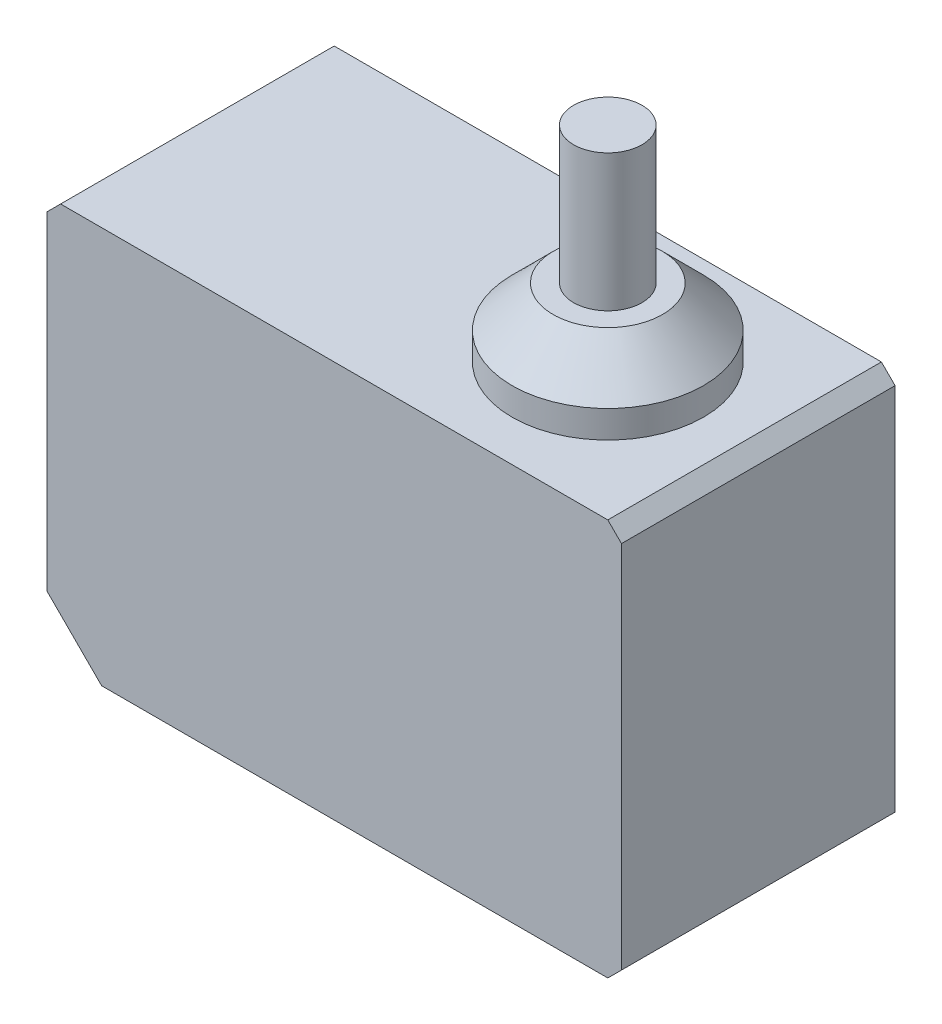
ISO-10303-21;
HEADER;
FILE_DESCRIPTION(('STEP AP214'),'2;1');
FILE_NAME('part.step','',(''),(''),'','','');
FILE_SCHEMA(('AUTOMOTIVE_DESIGN { 1 0 10303 214 1 1 1 1 }'));
ENDSEC;
DATA;
#1=APPLICATION_CONTEXT('core data for automotive mechanical design processes');
#2=APPLICATION_PROTOCOL_DEFINITION('international standard','automotive_design',2000,#1);
#3=PRODUCT_CONTEXT('',#1,'mechanical');
#4=PRODUCT('Part','Part','',(#3));
#5=PRODUCT_RELATED_PRODUCT_CATEGORY('part','',(#4));
#6=PRODUCT_DEFINITION_FORMATION('','',#4);
#7=PRODUCT_DEFINITION_CONTEXT('part definition',#1,'design');
#8=PRODUCT_DEFINITION('design','',#6,#7);
#9=PRODUCT_DEFINITION_SHAPE('','',#8);
#10=(LENGTH_UNIT() NAMED_UNIT(*) SI_UNIT(.MILLI.,.METRE.));
#11=(NAMED_UNIT(*) PLANE_ANGLE_UNIT() SI_UNIT($,.RADIAN.));
#12=(NAMED_UNIT(*) SI_UNIT($,.STERADIAN.) SOLID_ANGLE_UNIT());
#13=UNCERTAINTY_MEASURE_WITH_UNIT(LENGTH_MEASURE(1.E-05),#10,'distance_accuracy_value','');
#14=(GEOMETRIC_REPRESENTATION_CONTEXT(3) GLOBAL_UNCERTAINTY_ASSIGNED_CONTEXT((#13)) GLOBAL_UNIT_ASSIGNED_CONTEXT((#10,
#11,#12)) REPRESENTATION_CONTEXT('',''));
#15=CARTESIAN_POINT('',(0.,0.,0.));
#16=DIRECTION('',(0.,0.,1.));
#17=DIRECTION('',(1.,0.,0.));
#18=AXIS2_PLACEMENT_3D('',#15,#16,#17);
#19=CARTESIAN_POINT('',(31.,34.,10.));
#20=DIRECTION('',(0.,1.,0.));
#21=DIRECTION('',(0.,0.,1.));
#22=AXIS2_PLACEMENT_3D('',#19,#20,#21);
#23=PLANE('',#22);
#24=CARTESIAN_POINT('',(31.,34.,10.));
#25=DIRECTION('',(0.,1.,0.));
#26=DIRECTION('',(0.,0.,1.));
#27=AXIS2_PLACEMENT_3D('',#24,#25,#26);
#28=CIRCLE('',#27,4.);
#29=CARTESIAN_POINT('',(31.,34.,6.));
#30=VERTEX_POINT('',#29);
#31=EDGE_CURVE('E43',#30,#30,#28,.T.);
#32=ORIENTED_EDGE('',*,*,#31,.T.);
#33=EDGE_LOOP('',(#32));
#34=FACE_BOUND('',#33,.T.);
#35=CARTESIAN_POINT('',(31.,34.,10.));
#36=DIRECTION('',(0.,1.,0.));
#37=DIRECTION('',(0.,0.,1.));
#38=AXIS2_PLACEMENT_3D('',#35,#36,#37);
#39=CIRCLE('',#38,2.5);
#40=CARTESIAN_POINT('',(31.,34.,12.5));
#41=VERTEX_POINT('',#40);
#42=EDGE_CURVE('E232',#41,#41,#39,.T.);
#43=ORIENTED_EDGE('',*,*,#42,.F.);
#44=EDGE_LOOP('',(#43));
#45=FACE_BOUND('',#44,.T.);
#46=ADVANCED_FACE('F35',(#34,#45),#23,.T.);
#47=CARTESIAN_POINT('',(0.,29.,20.));
#48=DIRECTION('',(0.,-1.,0.));
#49=DIRECTION('',(0.,0.,-1.));
#50=AXIS2_PLACEMENT_3D('',#47,#48,#49);
#51=PLANE('',#50);
#52=DIRECTION('',(-1.,0.,0.));
#53=VECTOR('',#52,1.);
#54=CARTESIAN_POINT('',(0.,29.,20.));
#55=LINE('',#54,#53);
#56=CARTESIAN_POINT('',(41.,29.,20.));
#57=VERTEX_POINT('',#56);
#58=CARTESIAN_POINT('',(1.,29.,20.));
#59=VERTEX_POINT('',#58);
#60=EDGE_CURVE('E115',#57,#59,#55,.T.);
#61=ORIENTED_EDGE('',*,*,#60,.F.);
#62=DIRECTION('',(0.,0.,-1.));
#63=VECTOR('',#62,1.);
#64=CARTESIAN_POINT('',(41.,29.,20.));
#65=LINE('',#64,#63);
#66=CARTESIAN_POINT('',(41.,29.,0.));
#67=VERTEX_POINT('',#66);
#68=EDGE_CURVE('E135',#57,#67,#65,.T.);
#69=ORIENTED_EDGE('',*,*,#68,.T.);
#70=DIRECTION('',(-1.,0.,0.));
#71=VECTOR('',#70,1.);
#72=CARTESIAN_POINT('',(0.,29.,0.));
#73=LINE('',#72,#71);
#74=CARTESIAN_POINT('',(1.,29.,0.));
#75=VERTEX_POINT('',#74);
#76=EDGE_CURVE('E121',#67,#75,#73,.T.);
#77=ORIENTED_EDGE('',*,*,#76,.T.);
#78=DIRECTION('',(0.,0.,1.));
#79=VECTOR('',#78,1.);
#80=CARTESIAN_POINT('',(1.,29.,20.));
#81=LINE('',#80,#79);
#82=EDGE_CURVE('E133',#75,#59,#81,.T.);
#83=ORIENTED_EDGE('',*,*,#82,.T.);
#84=EDGE_LOOP('',(#61,#69,#77,#83));
#85=FACE_BOUND('',#84,.T.);
#86=CARTESIAN_POINT('',(31.,29.,10.));
#87=DIRECTION('',(0.,-1.,0.));
#88=DIRECTION('',(0.,0.,-1.));
#89=AXIS2_PLACEMENT_3D('',#86,#87,#88);
#90=CIRCLE('',#89,7.);
#91=CARTESIAN_POINT('',(31.,29.,3.));
#92=VERTEX_POINT('',#91);
#93=EDGE_CURVE('E160',#92,#92,#90,.F.);
#94=ORIENTED_EDGE('',*,*,#93,.F.);
#95=EDGE_LOOP('',(#94));
#96=FACE_BOUND('',#95,.T.);
#97=ADVANCED_FACE('F183',(#85,#96),#51,.F.);
#98=CARTESIAN_POINT('',(0.,0.,20.));
#99=DIRECTION('',(1.,0.,0.));
#100=DIRECTION('',(0.,0.,-1.));
#101=AXIS2_PLACEMENT_3D('',#98,#99,#100);
#102=PLANE('',#101);
#103=DIRECTION('',(0.,-1.,0.));
#104=VECTOR('',#103,1.);
#105=CARTESIAN_POINT('',(0.,0.,20.));
#106=LINE('',#105,#104);
#107=CARTESIAN_POINT('',(0.,28.,20.));
#108=VERTEX_POINT('',#107);
#109=CARTESIAN_POINT('',(0.,4.00000000000002,20.));
#110=VERTEX_POINT('',#109);
#111=EDGE_CURVE('E128',#108,#110,#106,.T.);
#112=ORIENTED_EDGE('',*,*,#111,.F.);
#113=DIRECTION('',(0.,0.,-1.));
#114=VECTOR('',#113,1.);
#115=CARTESIAN_POINT('',(0.,28.,20.));
#116=LINE('',#115,#114);
#117=CARTESIAN_POINT('',(0.,28.,0.));
#118=VERTEX_POINT('',#117);
#119=EDGE_CURVE('E150',#108,#118,#116,.T.);
#120=ORIENTED_EDGE('',*,*,#119,.T.);
#121=DIRECTION('',(0.,-1.,0.));
#122=VECTOR('',#121,1.);
#123=CARTESIAN_POINT('',(0.,0.,0.));
#124=LINE('',#123,#122);
#125=CARTESIAN_POINT('',(0.,4.00000000000002,0.));
#126=VERTEX_POINT('',#125);
#127=EDGE_CURVE('E119',#118,#126,#124,.T.);
#128=ORIENTED_EDGE('',*,*,#127,.T.);
#129=DIRECTION('',(0.,0.,1.));
#130=VECTOR('',#129,1.);
#131=CARTESIAN_POINT('',(0.,4.00000000000002,20.));
#132=LINE('',#131,#130);
#133=EDGE_CURVE('E109',#126,#110,#132,.T.);
#134=ORIENTED_EDGE('',*,*,#133,.T.);
#135=EDGE_LOOP('',(#112,#120,#128,#134));
#136=FACE_BOUND('',#135,.T.);
#137=ADVANCED_FACE('F188',(#136),#102,.F.);
#138=CARTESIAN_POINT('',(0.,0.,20.));
#139=DIRECTION('',(0.,1.,0.));
#140=DIRECTION('',(0.,0.,1.));
#141=AXIS2_PLACEMENT_3D('',#138,#139,#140);
#142=PLANE('',#141);
#143=DIRECTION('',(1.,0.,0.));
#144=VECTOR('',#143,1.);
#145=CARTESIAN_POINT('',(0.,0.,0.));
#146=LINE('',#145,#144);
#147=CARTESIAN_POINT('',(4.00000000000001,0.,0.));
#148=VERTEX_POINT('',#147);
#149=CARTESIAN_POINT('',(41.,0.,0.));
#150=VERTEX_POINT('',#149);
#151=EDGE_CURVE('E113',#148,#150,#146,.T.);
#152=ORIENTED_EDGE('',*,*,#151,.T.);
#153=DIRECTION('',(0.,0.,1.));
#154=VECTOR('',#153,1.);
#155=CARTESIAN_POINT('',(41.,0.,20.));
#156=LINE('',#155,#154);
#157=CARTESIAN_POINT('',(41.,0.,20.));
#158=VERTEX_POINT('',#157);
#159=EDGE_CURVE('E50',#150,#158,#156,.T.);
#160=ORIENTED_EDGE('',*,*,#159,.T.);
#161=DIRECTION('',(1.,0.,0.));
#162=VECTOR('',#161,1.);
#163=CARTESIAN_POINT('',(0.,0.,20.));
#164=LINE('',#163,#162);
#165=CARTESIAN_POINT('',(4.00000000000001,0.,20.));
#166=VERTEX_POINT('',#165);
#167=EDGE_CURVE('E114',#166,#158,#164,.T.);
#168=ORIENTED_EDGE('',*,*,#167,.F.);
#169=DIRECTION('',(0.,0.,-1.));
#170=VECTOR('',#169,1.);
#171=CARTESIAN_POINT('',(4.00000000000001,0.,20.));
#172=LINE('',#171,#170);
#173=EDGE_CURVE('E107',#166,#148,#172,.T.);
#174=ORIENTED_EDGE('',*,*,#173,.T.);
#175=EDGE_LOOP('',(#152,#160,#168,#174));
#176=FACE_BOUND('',#175,.T.);
#177=ADVANCED_FACE('F112',(#176),#142,.F.);
#178=CARTESIAN_POINT('',(42.,0.,20.));
#179=DIRECTION('',(-1.,0.,0.));
#180=DIRECTION('',(0.,0.,1.));
#181=AXIS2_PLACEMENT_3D('',#178,#179,#180);
#182=PLANE('',#181);
#183=DIRECTION('',(0.,1.,0.));
#184=VECTOR('',#183,1.);
#185=CARTESIAN_POINT('',(42.,0.,20.));
#186=LINE('',#185,#184);
#187=CARTESIAN_POINT('',(42.,1.00000000000001,20.));
#188=VERTEX_POINT('',#187);
#189=CARTESIAN_POINT('',(42.,28.,20.));
#190=VERTEX_POINT('',#189);
#191=EDGE_CURVE('E224',#188,#190,#186,.T.);
#192=ORIENTED_EDGE('',*,*,#191,.F.);
#193=DIRECTION('',(0.,0.,-1.));
#194=VECTOR('',#193,1.);
#195=CARTESIAN_POINT('',(42.,1.00000000000001,20.));
#196=LINE('',#195,#194);
#197=CARTESIAN_POINT('',(42.,1.00000000000001,0.));
#198=VERTEX_POINT('',#197);
#199=EDGE_CURVE('E153',#188,#198,#196,.T.);
#200=ORIENTED_EDGE('',*,*,#199,.T.);
#201=DIRECTION('',(0.,1.,0.));
#202=VECTOR('',#201,1.);
#203=CARTESIAN_POINT('',(42.,0.,0.));
#204=LINE('',#203,#202);
#205=CARTESIAN_POINT('',(42.,28.,0.));
#206=VERTEX_POINT('',#205);
#207=EDGE_CURVE('E118',#198,#206,#204,.T.);
#208=ORIENTED_EDGE('',*,*,#207,.T.);
#209=DIRECTION('',(0.,0.,1.));
#210=VECTOR('',#209,1.);
#211=CARTESIAN_POINT('',(42.,28.,20.));
#212=LINE('',#211,#210);
#213=EDGE_CURVE('E143',#206,#190,#212,.T.);
#214=ORIENTED_EDGE('',*,*,#213,.T.);
#215=EDGE_LOOP('',(#192,#200,#208,#214));
#216=FACE_BOUND('',#215,.T.);
#217=ADVANCED_FACE('F196',(#216),#182,.F.);
#218=CARTESIAN_POINT('',(0.,0.,20.));
#219=DIRECTION('',(0.,0.,-1.));
#220=DIRECTION('',(-1.,0.,0.));
#221=AXIS2_PLACEMENT_3D('',#218,#219,#220);
#222=PLANE('',#221);
#223=ORIENTED_EDGE('',*,*,#167,.T.);
#224=DIRECTION('',(-0.707106781186548,-0.707106781186548,0.));
#225=VECTOR('',#224,1.);
#226=CARTESIAN_POINT('',(42.,1.00000000000001,20.));
#227=LINE('',#226,#225);
#228=EDGE_CURVE('E158',#158,#188,#227,.F.);
#229=ORIENTED_EDGE('',*,*,#228,.T.);
#230=ORIENTED_EDGE('',*,*,#191,.T.);
#231=DIRECTION('',(0.707106781186545,-0.70710678118655,0.));
#232=VECTOR('',#231,1.);
#233=CARTESIAN_POINT('',(41.,29.,20.));
#234=LINE('',#233,#232);
#235=EDGE_CURVE('E148',#190,#57,#234,.F.);
#236=ORIENTED_EDGE('',*,*,#235,.T.);
#237=ORIENTED_EDGE('',*,*,#60,.T.);
#238=DIRECTION('',(0.707106781186548,0.707106781186548,0.));
#239=VECTOR('',#238,1.);
#240=CARTESIAN_POINT('',(0.,28.,20.));
#241=LINE('',#240,#239);
#242=EDGE_CURVE('E146',#59,#108,#241,.F.);
#243=ORIENTED_EDGE('',*,*,#242,.T.);
#244=ORIENTED_EDGE('',*,*,#111,.T.);
#245=DIRECTION('',(-0.707106781186546,0.707106781186549,0.));
#246=VECTOR('',#245,1.);
#247=CARTESIAN_POINT('',(4.00000000000001,0.,20.));
#248=LINE('',#247,#246);
#249=EDGE_CURVE('E131',#110,#166,#248,.F.);
#250=ORIENTED_EDGE('',*,*,#249,.T.);
#251=EDGE_LOOP('',(#223,#229,#230,#236,#237,#243,#244,#250));
#252=FACE_BOUND('',#251,.T.);
#253=ADVANCED_FACE('F193',(#252),#222,.F.);
#254=CARTESIAN_POINT('',(0.,0.,0.));
#255=DIRECTION('',(0.,0.,-1.));
#256=DIRECTION('',(-1.,0.,0.));
#257=AXIS2_PLACEMENT_3D('',#254,#255,#256);
#258=PLANE('',#257);
#259=ORIENTED_EDGE('',*,*,#207,.F.);
#260=DIRECTION('',(0.707106781186548,0.707106781186548,0.));
#261=VECTOR('',#260,1.);
#262=CARTESIAN_POINT('',(20.5,-20.5,0.));
#263=LINE('',#262,#261);
#264=EDGE_CURVE('E58',#198,#150,#263,.F.);
#265=ORIENTED_EDGE('',*,*,#264,.T.);
#266=ORIENTED_EDGE('',*,*,#151,.F.);
#267=DIRECTION('',(0.707106781186546,-0.707106781186549,0.));
#268=VECTOR('',#267,1.);
#269=CARTESIAN_POINT('',(2.00000000000001,2.00000000000001,0.));
#270=LINE('',#269,#268);
#271=EDGE_CURVE('E103',#148,#126,#270,.F.);
#272=ORIENTED_EDGE('',*,*,#271,.T.);
#273=ORIENTED_EDGE('',*,*,#127,.F.);
#274=DIRECTION('',(-0.707106781186548,-0.707106781186548,0.));
#275=VECTOR('',#274,1.);
#276=CARTESIAN_POINT('',(-14.,14.,0.));
#277=LINE('',#276,#275);
#278=EDGE_CURVE('E138',#118,#75,#277,.F.);
#279=ORIENTED_EDGE('',*,*,#278,.T.);
#280=ORIENTED_EDGE('',*,*,#76,.F.);
#281=DIRECTION('',(-0.707106781186545,0.70710678118655,0.));
#282=VECTOR('',#281,1.);
#283=CARTESIAN_POINT('',(35.0000000000001,34.9999999999999,0.));
#284=LINE('',#283,#282);
#285=EDGE_CURVE('E140',#67,#206,#284,.F.);
#286=ORIENTED_EDGE('',*,*,#285,.T.);
#287=EDGE_LOOP('',(#259,#265,#266,#272,#273,#279,#280,#286));
#288=FACE_BOUND('',#287,.T.);
#289=ADVANCED_FACE('F117',(#288),#258,.T.);
#290=CARTESIAN_POINT('',(4.00000000000001,0.,20.));
#291=DIRECTION('',(0.707106781186549,0.707106781186546,0.));
#292=DIRECTION('',(0.,0.,-1.));
#293=AXIS2_PLACEMENT_3D('',#290,#291,#292);
#294=PLANE('',#293);
#295=ORIENTED_EDGE('',*,*,#249,.F.);
#296=ORIENTED_EDGE('',*,*,#133,.F.);
#297=ORIENTED_EDGE('',*,*,#271,.F.);
#298=ORIENTED_EDGE('',*,*,#173,.F.);
#299=EDGE_LOOP('',(#295,#296,#297,#298));
#300=FACE_BOUND('',#299,.T.);
#301=ADVANCED_FACE('F106',(#300),#294,.F.);
#302=CARTESIAN_POINT('',(41.,29.,20.));
#303=DIRECTION('',(-0.70710678118655,-0.707106781186545,0.));
#304=DIRECTION('',(0.,0.,-1.));
#305=AXIS2_PLACEMENT_3D('',#302,#303,#304);
#306=PLANE('',#305);
#307=ORIENTED_EDGE('',*,*,#235,.F.);
#308=ORIENTED_EDGE('',*,*,#213,.F.);
#309=ORIENTED_EDGE('',*,*,#285,.F.);
#310=ORIENTED_EDGE('',*,*,#68,.F.);
#311=EDGE_LOOP('',(#307,#308,#309,#310));
#312=FACE_BOUND('',#311,.T.);
#313=ADVANCED_FACE('F210',(#312),#306,.F.);
#314=CARTESIAN_POINT('',(0.,28.,20.));
#315=DIRECTION('',(0.707106781186547,-0.707106781186547,0.));
#316=DIRECTION('',(0.,0.,-1.));
#317=AXIS2_PLACEMENT_3D('',#314,#315,#316);
#318=PLANE('',#317);
#319=ORIENTED_EDGE('',*,*,#242,.F.);
#320=ORIENTED_EDGE('',*,*,#82,.F.);
#321=ORIENTED_EDGE('',*,*,#278,.F.);
#322=ORIENTED_EDGE('',*,*,#119,.F.);
#323=EDGE_LOOP('',(#319,#320,#321,#322));
#324=FACE_BOUND('',#323,.T.);
#325=ADVANCED_FACE('F213',(#324),#318,.F.);
#326=CARTESIAN_POINT('',(42.,1.00000000000001,20.));
#327=DIRECTION('',(-0.707106781186547,0.707106781186547,0.));
#328=DIRECTION('',(0.,0.,-1.));
#329=AXIS2_PLACEMENT_3D('',#326,#327,#328);
#330=PLANE('',#329);
#331=ORIENTED_EDGE('',*,*,#228,.F.);
#332=ORIENTED_EDGE('',*,*,#159,.F.);
#333=ORIENTED_EDGE('',*,*,#264,.F.);
#334=ORIENTED_EDGE('',*,*,#199,.F.);
#335=EDGE_LOOP('',(#331,#332,#333,#334));
#336=FACE_BOUND('',#335,.T.);
#337=ADVANCED_FACE('F178',(#336),#330,.F.);
#338=CARTESIAN_POINT('',(31.,34.,10.));
#339=DIRECTION('',(0.,-1.,0.));
#340=DIRECTION('',(0.,0.,-1.));
#341=AXIS2_PLACEMENT_3D('',#338,#339,#340);
#342=CYLINDRICAL_SURFACE('',#341,7.);
#343=CARTESIAN_POINT('',(31.,31.,10.));
#344=DIRECTION('',(0.,1.,0.));
#345=DIRECTION('',(0.,0.,1.));
#346=AXIS2_PLACEMENT_3D('',#343,#344,#345);
#347=CIRCLE('',#346,7.);
#348=CARTESIAN_POINT('',(31.,31.,3.));
#349=VERTEX_POINT('',#348);
#350=EDGE_CURVE('E11',#349,#349,#347,.F.);
#351=ORIENTED_EDGE('',*,*,#350,.T.);
#352=EDGE_LOOP('',(#351));
#353=FACE_BOUND('',#352,.T.);
#354=ORIENTED_EDGE('',*,*,#93,.T.);
#355=EDGE_LOOP('',(#354));
#356=FACE_BOUND('',#355,.T.);
#357=ADVANCED_FACE('F169',(#353,#356),#342,.T.);
#358=CARTESIAN_POINT('',(31.,34.,10.));
#359=DIRECTION('',(0.,-1.,0.));
#360=DIRECTION('',(0.,0.,-1.));
#361=AXIS2_PLACEMENT_3D('',#358,#359,#360);
#362=CONICAL_SURFACE('',#361,4.,0.785398163397448);
#363=CARTESIAN_POINT('',(31.,31.,3.));
#364=CARTESIAN_POINT('',(31.,31.03125,3.03125));
#365=CARTESIAN_POINT('',(31.,31.0625,3.0625));
#366=CARTESIAN_POINT('',(31.,31.125,3.125));
#367=CARTESIAN_POINT('',(31.,31.15625,3.15625));
#368=CARTESIAN_POINT('',(31.,31.21875,3.21875));
#369=CARTESIAN_POINT('',(31.,31.25,3.25));
#370=CARTESIAN_POINT('',(31.,31.3125,3.3125));
#371=CARTESIAN_POINT('',(31.,31.34375,3.34375));
#372=CARTESIAN_POINT('',(31.,31.40625,3.40625));
#373=CARTESIAN_POINT('',(31.,31.4375,3.4375));
#374=CARTESIAN_POINT('',(31.,31.5,3.5));
#375=CARTESIAN_POINT('',(31.,31.53125,3.53125));
#376=CARTESIAN_POINT('',(31.,31.59375,3.59375));
#377=CARTESIAN_POINT('',(31.,31.625,3.625));
#378=CARTESIAN_POINT('',(31.,31.6875,3.6875));
#379=CARTESIAN_POINT('',(31.,31.71875,3.71875));
#380=CARTESIAN_POINT('',(31.,31.78125,3.78125));
#381=CARTESIAN_POINT('',(31.,31.8125,3.8125));
#382=CARTESIAN_POINT('',(31.,31.875,3.875));
#383=CARTESIAN_POINT('',(31.,31.90625,3.90625));
#384=CARTESIAN_POINT('',(31.,31.96875,3.96875));
#385=CARTESIAN_POINT('',(31.,32.,4.));
#386=CARTESIAN_POINT('',(31.,32.0625,4.0625));
#387=CARTESIAN_POINT('',(31.,32.09375,4.09375));
#388=CARTESIAN_POINT('',(31.,32.15625,4.15625));
#389=CARTESIAN_POINT('',(31.,32.1875,4.1875));
#390=CARTESIAN_POINT('',(31.,32.25,4.25));
#391=CARTESIAN_POINT('',(31.,32.28125,4.28125));
#392=CARTESIAN_POINT('',(31.,32.34375,4.34375));
#393=CARTESIAN_POINT('',(31.,32.375,4.375));
#394=CARTESIAN_POINT('',(31.,32.4375,4.4375));
#395=CARTESIAN_POINT('',(31.,32.46875,4.46875));
#396=CARTESIAN_POINT('',(31.,32.53125,4.53125));
#397=CARTESIAN_POINT('',(31.,32.5625,4.5625));
#398=CARTESIAN_POINT('',(31.,32.625,4.625));
#399=CARTESIAN_POINT('',(31.,32.65625,4.65625));
#400=CARTESIAN_POINT('',(31.,32.71875,4.71875));
#401=CARTESIAN_POINT('',(31.,32.75,4.75));
#402=CARTESIAN_POINT('',(31.,32.8125,4.8125));
#403=CARTESIAN_POINT('',(31.,32.84375,4.84375));
#404=CARTESIAN_POINT('',(31.,32.90625,4.90625));
#405=CARTESIAN_POINT('',(31.,32.9375,4.9375));
#406=CARTESIAN_POINT('',(31.,33.,5.));
#407=CARTESIAN_POINT('',(31.,33.03125,5.03125));
#408=CARTESIAN_POINT('',(31.,33.09375,5.09375));
#409=CARTESIAN_POINT('',(31.,33.125,5.125));
#410=CARTESIAN_POINT('',(31.,33.1875,5.1875));
#411=CARTESIAN_POINT('',(31.,33.21875,5.21875));
#412=CARTESIAN_POINT('',(31.,33.28125,5.28125));
#413=CARTESIAN_POINT('',(31.,33.3125,5.3125));
#414=CARTESIAN_POINT('',(31.,33.375,5.375));
#415=CARTESIAN_POINT('',(31.,33.40625,5.40625));
#416=CARTESIAN_POINT('',(31.,33.46875,5.46875));
#417=CARTESIAN_POINT('',(31.,33.5,5.5));
#418=CARTESIAN_POINT('',(31.,33.5625,5.5625));
#419=CARTESIAN_POINT('',(31.,33.59375,5.59375));
#420=CARTESIAN_POINT('',(31.,33.65625,5.65625));
#421=CARTESIAN_POINT('',(31.,33.6875,5.6875));
#422=CARTESIAN_POINT('',(31.,33.75,5.75));
#423=CARTESIAN_POINT('',(31.,33.78125,5.78125));
#424=CARTESIAN_POINT('',(31.,33.84375,5.84375));
#425=CARTESIAN_POINT('',(31.,33.875,5.875));
#426=CARTESIAN_POINT('',(31.,33.9375,5.9375));
#427=CARTESIAN_POINT('',(31.,33.96875,5.96875));
#428=CARTESIAN_POINT('',(31.,34.,6.));
#429=B_SPLINE_CURVE_WITH_KNOTS('',3,(#363,#364,#365,#366,#367,#368,#369,#370,#371,#372,#373,
#374,#375,#376,#377,#378,#379,#380,#381,#382,#383,#384,#385,#386,#387,#388,#389,#390,#391,#392,
#393,#394,#395,#396,#397,#398,#399,#400,#401,#402,#403,#404,#405,#406,#407,#408,#409,#410,#411,
#412,#413,#414,#415,#416,#417,#418,#419,#420,#421,#422,#423,#424,#425,#426,#427,#428),
.UNSPECIFIED.,.F.,.F.,(4,2,2,2,2,2,2,2,2,2,2,2,2,2,2,2,2,2,2,2,2,2,2,2,2,2,2,2,2,2,2,2,4),(0.,
0.132582521472478,0.265165042944956,0.397747564417433,0.530330085889908,0.662912607362389,
0.795495128834864,0.928077650307345,1.06066017177982,1.1932426932523,1.32582521472477,
1.45840773619726,1.59099025766973,1.72357277914221,1.85615530061469,1.98873782208717,
2.12132034355964,2.25390286503212,2.3864853865046,2.51906790797708,2.65165042944955,
2.78423295092203,2.91681547239451,3.04939799386699,3.18198051533946,3.31456303681194,
3.44714555828442,3.5797280797569,3.71231060122938,3.84489312270186,3.97747564417434,
4.11005816564681,4.24264068711929),.UNSPECIFIED.);
#430=EDGE_CURVE('BSEAM37',#349,#30,#429,.T.);
#431=ORIENTED_EDGE('',*,*,#350,.F.);
#432=ORIENTED_EDGE('',*,*,#31,.F.);
#433=ORIENTED_EDGE('',*,*,#430,.T.);
#434=ORIENTED_EDGE('',*,*,#430,.F.);
#435=EDGE_LOOP('',(#431,#433,#432,#434));
#436=FACE_BOUND('',#435,.T.);
#437=ADVANCED_FACE('F37',(#436),#362,.T.);
#438=CARTESIAN_POINT('',(31.,44.,10.));
#439=DIRECTION('',(0.,-1.,0.));
#440=DIRECTION('',(0.,0.,-1.));
#441=AXIS2_PLACEMENT_3D('',#438,#439,#440);
#442=CYLINDRICAL_SURFACE('',#441,2.5);
#443=CARTESIAN_POINT('',(31.,44.,10.));
#444=DIRECTION('',(0.,1.,0.));
#445=DIRECTION('',(0.,0.,1.));
#446=AXIS2_PLACEMENT_3D('',#443,#444,#445);
#447=CIRCLE('',#446,2.5);
#448=CARTESIAN_POINT('',(31.,44.,12.5));
#449=VERTEX_POINT('',#448);
#450=EDGE_CURVE('E123',#449,#449,#447,.T.);
#451=ORIENTED_EDGE('',*,*,#450,.F.);
#452=EDGE_LOOP('',(#451));
#453=FACE_BOUND('',#452,.T.);
#454=ORIENTED_EDGE('',*,*,#42,.T.);
#455=EDGE_LOOP('',(#454));
#456=FACE_BOUND('',#455,.T.);
#457=ADVANCED_FACE('F168',(#453,#456),#442,.T.);
#458=CARTESIAN_POINT('',(31.,44.,10.));
#459=DIRECTION('',(0.,1.,0.));
#460=DIRECTION('',(0.,0.,1.));
#461=AXIS2_PLACEMENT_3D('',#458,#459,#460);
#462=PLANE('',#461);
#463=ORIENTED_EDGE('',*,*,#450,.T.);
#464=EDGE_LOOP('',(#463));
#465=FACE_BOUND('',#464,.T.);
#466=ADVANCED_FACE('F175',(#465),#462,.T.);
#467=CLOSED_SHELL('',(#46,#97,#137,#177,#217,#253,#289,#301,#313,#325,#337,#357,#437,#457,#466));
#468=MANIFOLD_SOLID_BREP('B2',#467);
#469=ADVANCED_BREP_SHAPE_REPRESENTATION('',(#18,#468),#14);
#470=SHAPE_DEFINITION_REPRESENTATION(#9,#469);
ENDSEC;
END-ISO-10303-21;
